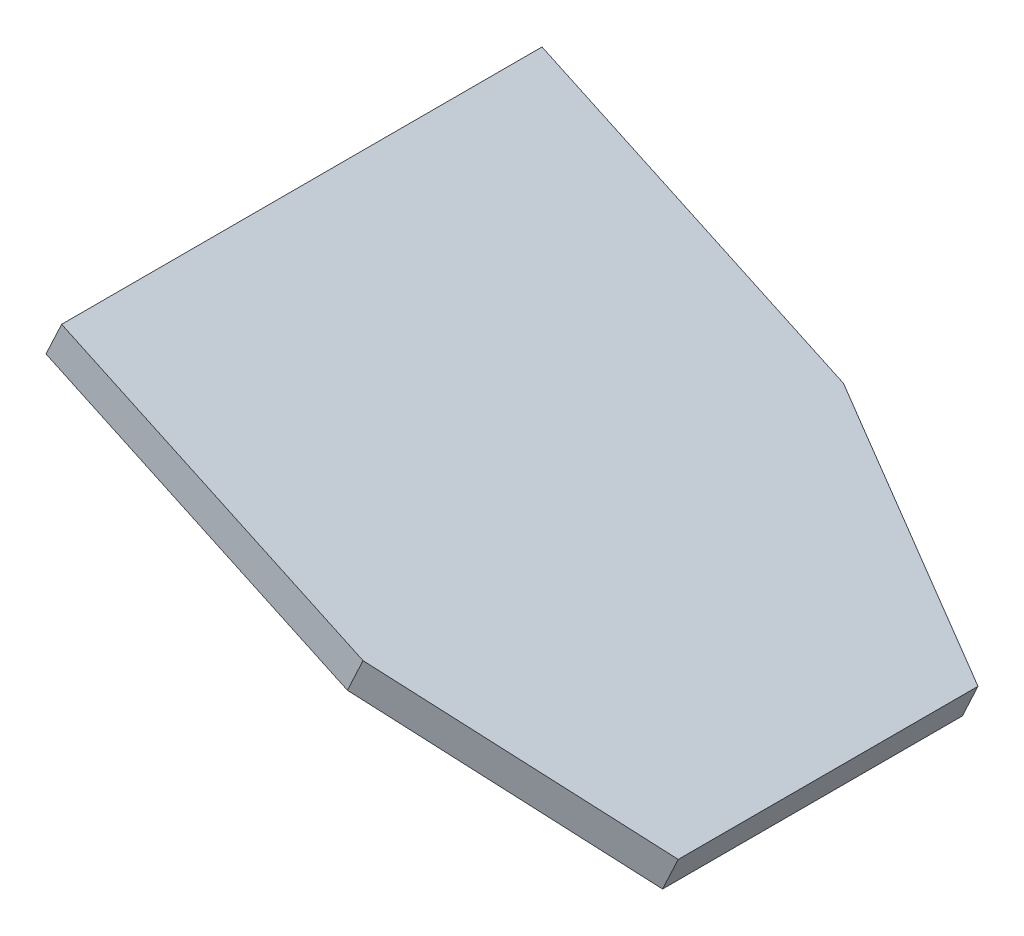
ISO-10303-21;
HEADER;
FILE_DESCRIPTION(('STEP AP214'),'2;1');
FILE_NAME('part.step','',(''),(''),'','','');
FILE_SCHEMA(('AUTOMOTIVE_DESIGN { 1 0 10303 214 1 1 1 1 }'));
ENDSEC;
DATA;
#1=APPLICATION_CONTEXT('core data for automotive mechanical design processes');
#2=APPLICATION_PROTOCOL_DEFINITION('international standard','automotive_design',2000,#1);
#3=PRODUCT_CONTEXT('',#1,'mechanical');
#4=PRODUCT('Part','Part','',(#3));
#5=PRODUCT_RELATED_PRODUCT_CATEGORY('part','',(#4));
#6=PRODUCT_DEFINITION_FORMATION('','',#4);
#7=PRODUCT_DEFINITION_CONTEXT('part definition',#1,'design');
#8=PRODUCT_DEFINITION('design','',#6,#7);
#9=PRODUCT_DEFINITION_SHAPE('','',#8);
#10=(LENGTH_UNIT() NAMED_UNIT(*) SI_UNIT(.MILLI.,.METRE.));
#11=(NAMED_UNIT(*) PLANE_ANGLE_UNIT() SI_UNIT($,.RADIAN.));
#12=(NAMED_UNIT(*) SI_UNIT($,.STERADIAN.) SOLID_ANGLE_UNIT());
#13=UNCERTAINTY_MEASURE_WITH_UNIT(LENGTH_MEASURE(1.E-05),#10,'distance_accuracy_value','');
#14=(GEOMETRIC_REPRESENTATION_CONTEXT(3) GLOBAL_UNCERTAINTY_ASSIGNED_CONTEXT((#13)) GLOBAL_UNIT_ASSIGNED_CONTEXT((#10,
#11,#12)) REPRESENTATION_CONTEXT('',''));
#15=CARTESIAN_POINT('',(0.,0.,0.));
#16=DIRECTION('',(0.,0.,1.));
#17=DIRECTION('',(1.,0.,0.));
#18=AXIS2_PLACEMENT_3D('',#15,#16,#17);
#19=CARTESIAN_POINT('',(0.,0.,-10.));
#20=DIRECTION('',(0.,0.,-1.));
#21=DIRECTION('',(-1.,0.,0.));
#22=AXIS2_PLACEMENT_3D('',#19,#20,#21);
#23=PLANE('',#22);
#24=DIRECTION('',(-0.216439613938103,-0.976296007119933,0.));
#25=VECTOR('',#24,1.);
#26=CARTESIAN_POINT('',(0.,0.,-10.));
#27=LINE('',#26,#25);
#28=CARTESIAN_POINT('',(14.0538319445026,63.3927392611051,-10.));
#29=VERTEX_POINT('',#28);
#30=CARTESIAN_POINT('',(0.,0.,-10.));
#31=VERTEX_POINT('',#30);
#32=EDGE_CURVE('E180',#29,#31,#27,.T.);
#33=ORIENTED_EDGE('',*,*,#32,.F.);
#34=DIRECTION('',(-0.906307787036649,0.4226182617407,0.));
#35=VECTOR('',#34,1.);
#36=CARTESIAN_POINT('',(26.7909292735097,57.4533332339235,-10.));
#37=LINE('',#36,#35);
#38=CARTESIAN_POINT('',(150.,0.,-10.));
#39=VERTEX_POINT('',#38);
#40=EDGE_CURVE('E162',#39,#29,#37,.T.);
#41=ORIENTED_EDGE('',*,*,#40,.F.);
#42=DIRECTION('',(1.,0.,0.));
#43=VECTOR('',#42,1.);
#44=CARTESIAN_POINT('',(0.,0.,-10.));
#45=LINE('',#44,#43);
#46=EDGE_CURVE('E182',#31,#39,#45,.T.);
#47=ORIENTED_EDGE('',*,*,#46,.F.);
#48=EDGE_LOOP('',(#33,#41,#47));
#49=FACE_BOUND('',#48,.T.);
#50=ADVANCED_FACE('F41',(#49),#23,.T.);
#51=CARTESIAN_POINT('',(0.,0.,10.));
#52=DIRECTION('',(0.,0.,-1.));
#53=DIRECTION('',(-1.,0.,0.));
#54=AXIS2_PLACEMENT_3D('',#51,#52,#53);
#55=PLANE('',#54);
#56=DIRECTION('',(0.906307787036649,-0.4226182617407,0.));
#57=VECTOR('',#56,1.);
#58=CARTESIAN_POINT('',(26.7909292735097,57.4533332339235,10.));
#59=LINE('',#58,#57);
#60=CARTESIAN_POINT('',(14.0538319445026,63.3927392611051,10.));
#61=VERTEX_POINT('',#60);
#62=CARTESIAN_POINT('',(150.,0.,10.));
#63=VERTEX_POINT('',#62);
#64=EDGE_CURVE('E159',#61,#63,#59,.T.);
#65=ORIENTED_EDGE('',*,*,#64,.F.);
#66=DIRECTION('',(-0.216439613938103,-0.976296007119933,0.));
#67=VECTOR('',#66,1.);
#68=CARTESIAN_POINT('',(0.,0.,10.));
#69=LINE('',#68,#67);
#70=CARTESIAN_POINT('',(0.,0.,10.));
#71=VERTEX_POINT('',#70);
#72=EDGE_CURVE('E174',#61,#71,#69,.T.);
#73=ORIENTED_EDGE('',*,*,#72,.T.);
#74=DIRECTION('',(1.,0.,0.));
#75=VECTOR('',#74,1.);
#76=CARTESIAN_POINT('',(0.,0.,10.));
#77=LINE('',#76,#75);
#78=EDGE_CURVE('E177',#71,#63,#77,.T.);
#79=ORIENTED_EDGE('',*,*,#78,.T.);
#80=EDGE_LOOP('',(#65,#73,#79));
#81=FACE_BOUND('',#80,.T.);
#82=ADVANCED_FACE('F190',(#81),#55,.F.);
#83=CARTESIAN_POINT('',(0.,0.,-10.));
#84=DIRECTION('',(-0.976296007119933,0.216439613938103,0.));
#85=DIRECTION('',(-0.216439613938103,-0.976296007119933,0.));
#86=AXIS2_PLACEMENT_3D('',#83,#84,#85);
#87=PLANE('',#86);
#88=DIRECTION('',(0.,0.,1.));
#89=VECTOR('',#88,1.);
#90=CARTESIAN_POINT('',(0.,0.,-10.));
#91=LINE('',#90,#89);
#92=EDGE_CURVE('E45',#31,#71,#91,.T.);
#93=ORIENTED_EDGE('',*,*,#92,.T.);
#94=ORIENTED_EDGE('',*,*,#72,.F.);
#95=DIRECTION('',(0.,0.,1.));
#96=VECTOR('',#95,1.);
#97=CARTESIAN_POINT('',(14.0538319445025,63.392739261105,-10.));
#98=LINE('',#97,#96);
#99=EDGE_CURVE('E11',#29,#61,#98,.T.);
#100=ORIENTED_EDGE('',*,*,#99,.F.);
#101=ORIENTED_EDGE('',*,*,#32,.T.);
#102=EDGE_LOOP('',(#93,#94,#100,#101));
#103=FACE_BOUND('',#102,.T.);
#104=ADVANCED_FACE('F43',(#103),#87,.T.);
#105=CARTESIAN_POINT('',(0.,0.,-10.));
#106=DIRECTION('',(0.,-1.,0.));
#107=DIRECTION('',(0.,0.,-1.));
#108=AXIS2_PLACEMENT_3D('',#105,#106,#107);
#109=PLANE('',#108);
#110=DIRECTION('',(0.,0.,1.));
#111=VECTOR('',#110,1.);
#112=CARTESIAN_POINT('',(150.,0.,-10.));
#113=LINE('',#112,#111);
#114=EDGE_CURVE('E50',#39,#63,#113,.T.);
#115=ORIENTED_EDGE('',*,*,#114,.T.);
#116=ORIENTED_EDGE('',*,*,#78,.F.);
#117=ORIENTED_EDGE('',*,*,#92,.F.);
#118=ORIENTED_EDGE('',*,*,#46,.T.);
#119=EDGE_LOOP('',(#115,#116,#117,#118));
#120=FACE_BOUND('',#119,.T.);
#121=ADVANCED_FACE('F185',(#120),#109,.T.);
#122=CARTESIAN_POINT('',(154.226182617407,9.06307787036651,10.));
#123=DIRECTION('',(-0.906307787036649,0.4226182617407,0.));
#124=DIRECTION('',(-0.4226182617407,-0.906307787036649,0.));
#125=AXIS2_PLACEMENT_3D('',#122,#123,#124);
#126=PLANE('',#125);
#127=ORIENTED_EDGE('',*,*,#114,.F.);
#128=DIRECTION('',(0.,0.,1.));
#129=VECTOR('',#128,1.);
#130=CARTESIAN_POINT('',(150.,0.,0.));
#131=LINE('',#130,#129);
#132=CARTESIAN_POINT('',(150.,0.,-41.1755526707922));
#133=VERTEX_POINT('',#132);
#134=EDGE_CURVE('E140',#133,#39,#131,.T.);
#135=ORIENTED_EDGE('',*,*,#134,.F.);
#136=DIRECTION('',(-0.4226182617407,-0.906307787036649,0.));
#137=VECTOR('',#136,1.);
#138=CARTESIAN_POINT('',(154.226182617407,9.0630778703665,-41.1755526707922));
#139=LINE('',#138,#137);
#140=CARTESIAN_POINT('',(154.226182617407,9.0630778703665,-41.1755526707922));
#141=VERTEX_POINT('',#140);
#142=EDGE_CURVE('E165',#141,#133,#139,.T.);
#143=ORIENTED_EDGE('',*,*,#142,.F.);
#144=DIRECTION('',(0.,0.,-1.));
#145=VECTOR('',#144,1.);
#146=CARTESIAN_POINT('',(154.226182617407,9.06307787036651,10.));
#147=LINE('',#146,#145);
#148=CARTESIAN_POINT('',(154.226182617407,9.06307787036649,39.9485791786938));
#149=VERTEX_POINT('',#148);
#150=EDGE_CURVE('E122',#149,#141,#147,.T.);
#151=ORIENTED_EDGE('',*,*,#150,.F.);
#152=DIRECTION('',(-0.4226182617407,-0.906307787036649,0.));
#153=VECTOR('',#152,1.);
#154=CARTESIAN_POINT('',(154.226182617407,9.06307787036649,39.9485791786938));
#155=LINE('',#154,#153);
#156=CARTESIAN_POINT('',(150.,0.,39.9485791786938));
#157=VERTEX_POINT('',#156);
#158=EDGE_CURVE('E167',#149,#157,#155,.T.);
#159=ORIENTED_EDGE('',*,*,#158,.T.);
#160=EDGE_CURVE('E156',#63,#157,#131,.T.);
#161=ORIENTED_EDGE('',*,*,#160,.F.);
#162=EDGE_LOOP('',(#127,#135,#143,#151,#159,#161));
#163=FACE_BOUND('',#162,.T.);
#164=ADVANCED_FACE('F199',(#163),#126,.F.);
#165=CARTESIAN_POINT('',(31.0171118909167,66.5164111042899,0.));
#166=DIRECTION('',(0.4226182617407,0.906307787036649,0.));
#167=DIRECTION('',(-0.906307787036649,0.4226182617407,0.));
#168=AXIS2_PLACEMENT_3D('',#165,#166,#167);
#169=PLANE('',#168);
#170=DIRECTION('',(0.851650739639146,-0.397131261967104,-0.34202014332567));
#171=VECTOR('',#170,1.);
#172=CARTESIAN_POINT('',(57.0661256449546,54.3695565033971,78.9677393397344));
#173=LINE('',#172,#171);
#174=CARTESIAN_POINT('',(93.3742560961446,37.4387972207165,64.3865132539509));
#175=VERTEX_POINT('',#174);
#176=EDGE_CURVE('E144',#175,#149,#173,.T.);
#177=ORIENTED_EDGE('',*,*,#176,.T.);
#178=ORIENTED_EDGE('',*,*,#150,.T.);
#179=DIRECTION('',(0.851650739639146,-0.397131261967104,0.34202014332567));
#180=VECTOR('',#179,1.);
#181=CARTESIAN_POINT('',(57.4235205794463,54.2029005084579,-80.0511841985216));
#182=LINE('',#181,#180);
#183=CARTESIAN_POINT('',(93.3742560961446,37.4387972207165,-65.6134867460491));
#184=VERTEX_POINT('',#183);
#185=EDGE_CURVE('E136',#184,#141,#182,.T.);
#186=ORIENTED_EDGE('',*,*,#185,.F.);
#187=DIRECTION('',(0.906307787036649,-0.4226182617407,0.));
#188=VECTOR('',#187,1.);
#189=CARTESIAN_POINT('',(31.0171118909167,66.5164111042899,-65.6134867460491));
#190=LINE('',#189,#188);
#191=CARTESIAN_POINT('',(11.8065552628461,75.4744407773795,-65.6134867460491));
#192=VERTEX_POINT('',#191);
#193=EDGE_CURVE('E116',#192,#184,#190,.T.);
#194=ORIENTED_EDGE('',*,*,#193,.F.);
#195=DIRECTION('',(0.,0.,1.));
#196=VECTOR('',#195,1.);
#197=CARTESIAN_POINT('',(11.8065552628461,75.4744407773795,0.));
#198=LINE('',#197,#196);
#199=CARTESIAN_POINT('',(11.8065552628461,75.4744407773795,64.3865132539509));
#200=VERTEX_POINT('',#199);
#201=EDGE_CURVE('E126',#192,#200,#198,.T.);
#202=ORIENTED_EDGE('',*,*,#201,.T.);
#203=DIRECTION('',(0.906307787036649,-0.4226182617407,0.));
#204=VECTOR('',#203,1.);
#205=CARTESIAN_POINT('',(31.0171118909167,66.5164111042899,64.3865132539509));
#206=LINE('',#205,#204);
#207=EDGE_CURVE('E131',#200,#175,#206,.T.);
#208=ORIENTED_EDGE('',*,*,#207,.T.);
#209=EDGE_LOOP('',(#177,#178,#186,#194,#202,#208));
#210=FACE_BOUND('',#209,.T.);
#211=ADVANCED_FACE('F134',(#210),#169,.T.);
#212=CARTESIAN_POINT('',(31.0171118909167,66.5164111042899,-65.6134867460491));
#213=DIRECTION('',(0.,0.,-1.));
#214=DIRECTION('',(-1.,0.,0.));
#215=AXIS2_PLACEMENT_3D('',#212,#213,#214);
#216=PLANE('',#215);
#217=DIRECTION('',(0.906307787036649,-0.4226182617407,0.));
#218=VECTOR('',#217,1.);
#219=CARTESIAN_POINT('',(26.7909292735097,57.4533332339235,-65.6134867460491));
#220=LINE('',#219,#218);
#221=CARTESIAN_POINT('',(7.58037264543911,66.411362907013,-65.6134867460491));
#222=VERTEX_POINT('',#221);
#223=CARTESIAN_POINT('',(89.1480734787376,28.37571935035,-65.6134867460491));
#224=VERTEX_POINT('',#223);
#225=EDGE_CURVE('E119',#222,#224,#220,.T.);
#226=ORIENTED_EDGE('',*,*,#225,.F.);
#227=DIRECTION('',(-0.4226182617407,-0.906307787036649,0.));
#228=VECTOR('',#227,1.);
#229=CARTESIAN_POINT('',(11.8065552628461,75.4744407773795,-65.6134867460491));
#230=LINE('',#229,#228);
#231=EDGE_CURVE('E112',#192,#222,#230,.T.);
#232=ORIENTED_EDGE('',*,*,#231,.F.);
#233=ORIENTED_EDGE('',*,*,#193,.T.);
#234=DIRECTION('',(-0.4226182617407,-0.906307787036649,0.));
#235=VECTOR('',#234,1.);
#236=CARTESIAN_POINT('',(93.3742560961446,37.4387972207165,-65.6134867460491));
#237=LINE('',#236,#235);
#238=EDGE_CURVE('E147',#184,#224,#237,.T.);
#239=ORIENTED_EDGE('',*,*,#238,.T.);
#240=EDGE_LOOP('',(#226,#232,#233,#239));
#241=FACE_BOUND('',#240,.T.);
#242=ADVANCED_FACE('F114',(#241),#216,.T.);
#243=CARTESIAN_POINT('',(11.8065552628461,75.4744407773795,0.));
#244=DIRECTION('',(0.906307787036649,-0.4226182617407,0.));
#245=DIRECTION('',(0.4226182617407,0.906307787036649,0.));
#246=AXIS2_PLACEMENT_3D('',#243,#244,#245);
#247=PLANE('',#246);
#248=DIRECTION('',(0.,0.,1.));
#249=VECTOR('',#248,1.);
#250=CARTESIAN_POINT('',(7.58037264543912,66.411362907013,0.));
#251=LINE('',#250,#249);
#252=CARTESIAN_POINT('',(7.58037264543911,66.411362907013,64.3865132539509));
#253=VERTEX_POINT('',#252);
#254=EDGE_CURVE('E149',#222,#253,#251,.T.);
#255=ORIENTED_EDGE('',*,*,#254,.T.);
#256=DIRECTION('',(-0.4226182617407,-0.906307787036649,0.));
#257=VECTOR('',#256,1.);
#258=CARTESIAN_POINT('',(11.8065552628461,75.4744407773795,64.3865132539509));
#259=LINE('',#258,#257);
#260=EDGE_CURVE('E123',#200,#253,#259,.T.);
#261=ORIENTED_EDGE('',*,*,#260,.F.);
#262=ORIENTED_EDGE('',*,*,#201,.F.);
#263=ORIENTED_EDGE('',*,*,#231,.T.);
#264=EDGE_LOOP('',(#255,#261,#262,#263));
#265=FACE_BOUND('',#264,.T.);
#266=ADVANCED_FACE('F127',(#265),#247,.F.);
#267=CARTESIAN_POINT('',(31.0171118909167,66.5164111042899,64.3865132539509));
#268=DIRECTION('',(0.,0.,-1.));
#269=DIRECTION('',(-1.,0.,0.));
#270=AXIS2_PLACEMENT_3D('',#267,#268,#269);
#271=PLANE('',#270);
#272=DIRECTION('',(0.906307787036649,-0.4226182617407,0.));
#273=VECTOR('',#272,1.);
#274=CARTESIAN_POINT('',(26.7909292735097,57.4533332339235,64.3865132539509));
#275=LINE('',#274,#273);
#276=CARTESIAN_POINT('',(89.1480734787376,28.37571935035,64.3865132539509));
#277=VERTEX_POINT('',#276);
#278=EDGE_CURVE('E151',#253,#277,#275,.T.);
#279=ORIENTED_EDGE('',*,*,#278,.T.);
#280=DIRECTION('',(-0.4226182617407,-0.906307787036649,0.));
#281=VECTOR('',#280,1.);
#282=CARTESIAN_POINT('',(93.3742560961446,37.4387972207165,64.3865132539509));
#283=LINE('',#282,#281);
#284=EDGE_CURVE('E169',#175,#277,#283,.T.);
#285=ORIENTED_EDGE('',*,*,#284,.F.);
#286=ORIENTED_EDGE('',*,*,#207,.F.);
#287=ORIENTED_EDGE('',*,*,#260,.T.);
#288=EDGE_LOOP('',(#279,#285,#286,#287));
#289=FACE_BOUND('',#288,.T.);
#290=ADVANCED_FACE('F205',(#289),#271,.F.);
#291=CARTESIAN_POINT('',(57.0661256449546,54.3695565033971,78.9677393397344));
#292=DIRECTION('',(-0.309975519219446,0.1445439584526,-0.939692620785908));
#293=DIRECTION('',(-0.949665648528747,0.,0.313265312482046));
#294=AXIS2_PLACEMENT_3D('',#291,#292,#293);
#295=PLANE('',#294);
#296=DIRECTION('',(0.851650739639146,-0.397131261967104,-0.34202014332567));
#297=VECTOR('',#296,1.);
#298=CARTESIAN_POINT('',(52.8399430275476,45.3064786330306,78.9677393397344));
#299=LINE('',#298,#297);
#300=EDGE_CURVE('E153',#277,#157,#299,.T.);
#301=ORIENTED_EDGE('',*,*,#300,.T.);
#302=ORIENTED_EDGE('',*,*,#158,.F.);
#303=ORIENTED_EDGE('',*,*,#176,.F.);
#304=ORIENTED_EDGE('',*,*,#284,.T.);
#305=EDGE_LOOP('',(#301,#302,#303,#304));
#306=FACE_BOUND('',#305,.T.);
#307=ADVANCED_FACE('F210',(#306),#295,.F.);
#308=CARTESIAN_POINT('',(57.4235205794463,54.2029005084579,-80.0511841985216));
#309=DIRECTION('',(0.309975519219445,-0.1445439584526,-0.939692620785908));
#310=DIRECTION('',(-0.949665648528747,0.,-0.313265312482046));
#311=AXIS2_PLACEMENT_3D('',#308,#309,#310);
#312=PLANE('',#311);
#313=DIRECTION('',(0.851650739639146,-0.397131261967104,0.34202014332567));
#314=VECTOR('',#313,1.);
#315=CARTESIAN_POINT('',(53.1973379620393,45.1398226380914,-80.0511841985216));
#316=LINE('',#315,#314);
#317=EDGE_CURVE('E137',#224,#133,#316,.T.);
#318=ORIENTED_EDGE('',*,*,#317,.F.);
#319=ORIENTED_EDGE('',*,*,#238,.F.);
#320=ORIENTED_EDGE('',*,*,#185,.T.);
#321=ORIENTED_EDGE('',*,*,#142,.T.);
#322=EDGE_LOOP('',(#318,#319,#320,#321));
#323=FACE_BOUND('',#322,.T.);
#324=ADVANCED_FACE('F201',(#323),#312,.T.);
#325=CARTESIAN_POINT('',(26.7909292735097,57.4533332339235,0.));
#326=DIRECTION('',(0.4226182617407,0.906307787036649,0.));
#327=DIRECTION('',(-0.906307787036649,0.4226182617407,0.));
#328=AXIS2_PLACEMENT_3D('',#325,#326,#327);
#329=PLANE('',#328);
#330=ORIENTED_EDGE('',*,*,#225,.T.);
#331=ORIENTED_EDGE('',*,*,#317,.T.);
#332=ORIENTED_EDGE('',*,*,#134,.T.);
#333=ORIENTED_EDGE('',*,*,#40,.T.);
#334=ORIENTED_EDGE('',*,*,#99,.T.);
#335=ORIENTED_EDGE('',*,*,#64,.T.);
#336=ORIENTED_EDGE('',*,*,#160,.T.);
#337=ORIENTED_EDGE('',*,*,#300,.F.);
#338=ORIENTED_EDGE('',*,*,#278,.F.);
#339=ORIENTED_EDGE('',*,*,#254,.F.);
#340=EDGE_LOOP('',(#330,#331,#332,#333,#334,#335,#336,#337,#338,#339));
#341=FACE_BOUND('',#340,.T.);
#342=ADVANCED_FACE('F196',(#341),#329,.F.);
#343=CLOSED_SHELL('',(#50,#82,#104,#121,#164,#211,#242,#266,#290,#307,#324,#342));
#344=MANIFOLD_SOLID_BREP('B2',#343);
#345=ADVANCED_BREP_SHAPE_REPRESENTATION('',(#18,#344),#14);
#346=SHAPE_DEFINITION_REPRESENTATION(#9,#345);
ENDSEC;
END-ISO-10303-21;
